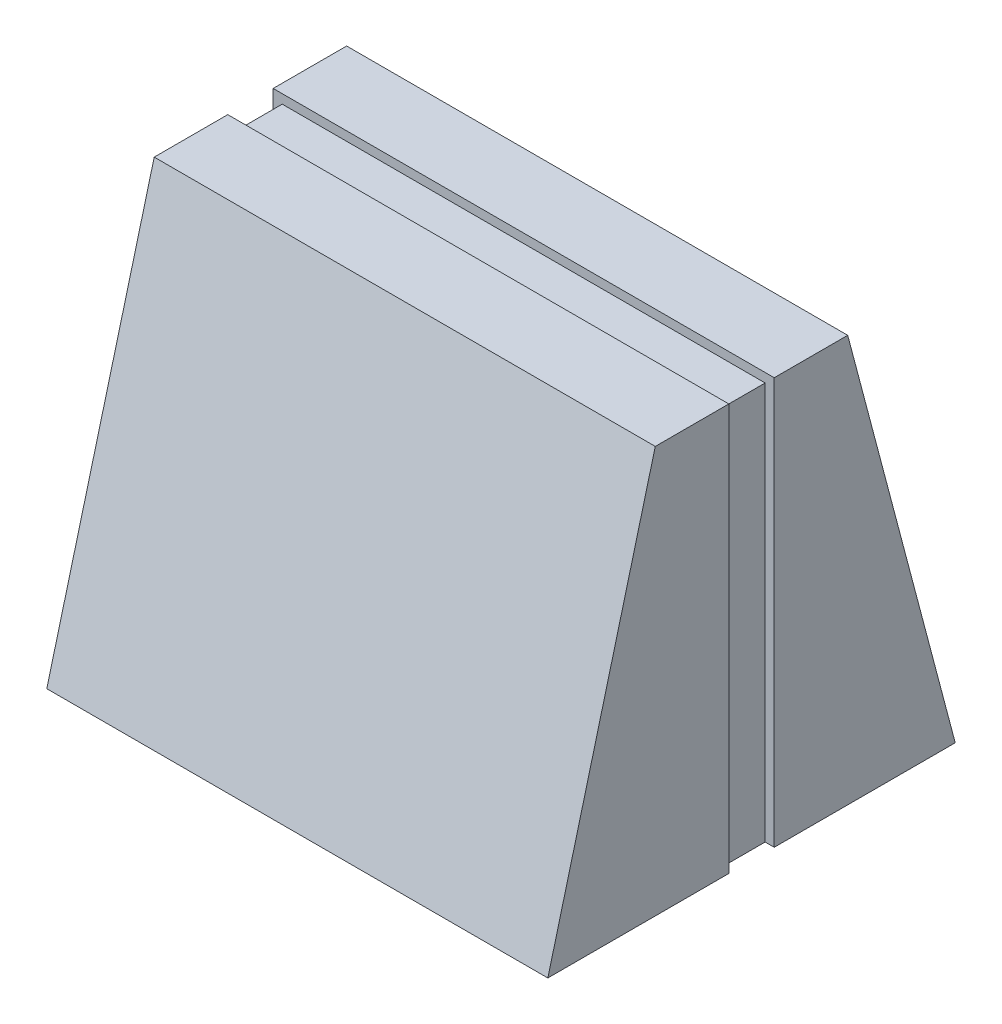
ISO-10303-21;
HEADER;
FILE_DESCRIPTION(('STEP AP214'),'2;1');
FILE_NAME('part.step','',(''),(''),'','','');
FILE_SCHEMA(('AUTOMOTIVE_DESIGN { 1 0 10303 214 1 1 1 1 }'));
ENDSEC;
DATA;
#1=APPLICATION_CONTEXT('core data for automotive mechanical design processes');
#2=APPLICATION_PROTOCOL_DEFINITION('international standard','automotive_design',2000,#1);
#3=PRODUCT_CONTEXT('',#1,'mechanical');
#4=PRODUCT('Part','Part','',(#3));
#5=PRODUCT_RELATED_PRODUCT_CATEGORY('part','',(#4));
#6=PRODUCT_DEFINITION_FORMATION('','',#4);
#7=PRODUCT_DEFINITION_CONTEXT('part definition',#1,'design');
#8=PRODUCT_DEFINITION('design','',#6,#7);
#9=PRODUCT_DEFINITION_SHAPE('','',#8);
#10=(LENGTH_UNIT() NAMED_UNIT(*) SI_UNIT(.MILLI.,.METRE.));
#11=(NAMED_UNIT(*) PLANE_ANGLE_UNIT() SI_UNIT($,.RADIAN.));
#12=(NAMED_UNIT(*) SI_UNIT($,.STERADIAN.) SOLID_ANGLE_UNIT());
#13=UNCERTAINTY_MEASURE_WITH_UNIT(LENGTH_MEASURE(1.E-05),#10,'distance_accuracy_value','');
#14=(GEOMETRIC_REPRESENTATION_CONTEXT(3) GLOBAL_UNCERTAINTY_ASSIGNED_CONTEXT((#13)) GLOBAL_UNIT_ASSIGNED_CONTEXT((#10,
#11,#12)) REPRESENTATION_CONTEXT('',''));
#15=CARTESIAN_POINT('',(0.,0.,0.));
#16=DIRECTION('',(0.,0.,1.));
#17=DIRECTION('',(1.,0.,0.));
#18=AXIS2_PLACEMENT_3D('',#15,#16,#17);
#19=CARTESIAN_POINT('',(0.,10.95,0.));
#20=DIRECTION('',(0.,-1.,0.));
#21=DIRECTION('',(0.,0.,-1.));
#22=AXIS2_PLACEMENT_3D('',#19,#20,#21);
#23=PLANE('',#22);
#24=DIRECTION('',(0.,0.,-1.));
#25=VECTOR('',#24,1.);
#26=CARTESIAN_POINT('',(-6.64999999999999,10.95,-0.625));
#27=LINE('',#26,#25);
#28=CARTESIAN_POINT('',(-6.64999999999999,10.95,0.625));
#29=VERTEX_POINT('',#28);
#30=CARTESIAN_POINT('',(-6.64999999999999,10.95,-0.625));
#31=VERTEX_POINT('',#30);
#32=EDGE_CURVE('E64',#29,#31,#27,.T.);
#33=ORIENTED_EDGE('',*,*,#32,.F.);
#34=DIRECTION('',(1.,0.,0.));
#35=VECTOR('',#34,1.);
#36=CARTESIAN_POINT('',(-6.90000000000002,10.95,0.625));
#37=LINE('',#36,#35);
#38=CARTESIAN_POINT('',(6.65000000000001,10.95,0.625));
#39=VERTEX_POINT('',#38);
#40=EDGE_CURVE('E175',#29,#39,#37,.T.);
#41=ORIENTED_EDGE('',*,*,#40,.T.);
#42=DIRECTION('',(0.,0.,1.));
#43=VECTOR('',#42,1.);
#44=CARTESIAN_POINT('',(6.65000000000001,10.95,0.625));
#45=LINE('',#44,#43);
#46=CARTESIAN_POINT('',(6.65000000000001,10.95,-0.625));
#47=VERTEX_POINT('',#46);
#48=EDGE_CURVE('E170',#47,#39,#45,.T.);
#49=ORIENTED_EDGE('',*,*,#48,.F.);
#50=DIRECTION('',(-1.,0.,0.));
#51=VECTOR('',#50,1.);
#52=CARTESIAN_POINT('',(-6.90000000000002,10.95,-0.625));
#53=LINE('',#52,#51);
#54=EDGE_CURVE('E173',#47,#31,#53,.T.);
#55=ORIENTED_EDGE('',*,*,#54,.T.);
#56=EDGE_LOOP('',(#33,#41,#49,#55));
#57=FACE_BOUND('',#56,.T.);
#58=ADVANCED_FACE('F45',(#57),#23,.F.);
#59=CARTESIAN_POINT('',(-6.89999999999999,0.,0.));
#60=DIRECTION('',(1.,0.,0.));
#61=DIRECTION('',(0.,1.,0.));
#62=AXIS2_PLACEMENT_3D('',#59,#60,#61);
#63=PLANE('',#62);
#64=DIRECTION('',(0.,0.,1.));
#65=VECTOR('',#64,1.);
#66=CARTESIAN_POINT('',(-6.89999999999999,0.,5.61000000000003));
#67=LINE('',#66,#65);
#68=CARTESIAN_POINT('',(-6.89999999999999,0.,-5.60999999999998));
#69=VERTEX_POINT('',#68);
#70=CARTESIAN_POINT('',(-6.89999999999999,0.,-0.625));
#71=VERTEX_POINT('',#70);
#72=EDGE_CURVE('E56',#69,#71,#67,.T.);
#73=ORIENTED_EDGE('',*,*,#72,.T.);
#74=DIRECTION('',(0.,1.,0.));
#75=VECTOR('',#74,1.);
#76=CARTESIAN_POINT('',(-6.90000000000002,10.95,-0.625));
#77=LINE('',#76,#75);
#78=CARTESIAN_POINT('',(-6.90000000000002,11.2,-0.625));
#79=VERTEX_POINT('',#78);
#80=EDGE_CURVE('E145',#71,#79,#77,.T.);
#81=ORIENTED_EDGE('',*,*,#80,.T.);
#82=DIRECTION('',(0.,0.,1.));
#83=VECTOR('',#82,1.);
#84=CARTESIAN_POINT('',(-6.89999999999999,11.2,2.65103330829409));
#85=LINE('',#84,#83);
#86=CARTESIAN_POINT('',(-6.89999999999999,11.2,-2.64896669170591));
#87=VERTEX_POINT('',#86);
#88=EDGE_CURVE('E291',#87,#79,#85,.T.);
#89=ORIENTED_EDGE('',*,*,#88,.F.);
#90=DIRECTION('',(0.,0.966783603676379,0.255596290392708));
#91=VECTOR('',#90,1.);
#92=CARTESIAN_POINT('',(-6.89999999999999,0.,-5.60999999999998));
#93=LINE('',#92,#91);
#94=EDGE_CURVE('E290',#69,#87,#93,.T.);
#95=ORIENTED_EDGE('',*,*,#94,.F.);
#96=EDGE_LOOP('',(#73,#81,#89,#95));
#97=FACE_BOUND('',#96,.T.);
#98=ADVANCED_FACE('F406',(#97),#63,.F.);
#99=CARTESIAN_POINT('',(6.90000000000001,0.,0.));
#100=DIRECTION('',(-1.,0.,0.));
#101=DIRECTION('',(0.,0.,1.));
#102=AXIS2_PLACEMENT_3D('',#99,#100,#101);
#103=PLANE('',#102);
#104=DIRECTION('',(0.,0.,-1.));
#105=VECTOR('',#104,1.);
#106=CARTESIAN_POINT('',(6.90000000000001,0.,5.61000000000003));
#107=LINE('',#106,#105);
#108=CARTESIAN_POINT('',(6.90000000000001,0.,5.61000000000003));
#109=VERTEX_POINT('',#108);
#110=CARTESIAN_POINT('',(6.90000000000001,0.,0.625));
#111=VERTEX_POINT('',#110);
#112=EDGE_CURVE('E378',#109,#111,#107,.T.);
#113=ORIENTED_EDGE('',*,*,#112,.T.);
#114=DIRECTION('',(0.,1.,0.));
#115=VECTOR('',#114,1.);
#116=CARTESIAN_POINT('',(6.90000000000001,10.95,0.625));
#117=LINE('',#116,#115);
#118=CARTESIAN_POINT('',(6.90000000000001,11.2,0.625));
#119=VERTEX_POINT('',#118);
#120=EDGE_CURVE('E415',#111,#119,#117,.T.);
#121=ORIENTED_EDGE('',*,*,#120,.T.);
#122=DIRECTION('',(0.,0.,-1.));
#123=VECTOR('',#122,1.);
#124=CARTESIAN_POINT('',(6.90000000000001,11.2,2.65103330829409));
#125=LINE('',#124,#123);
#126=CARTESIAN_POINT('',(6.90000000000001,11.2,2.65103330829409));
#127=VERTEX_POINT('',#126);
#128=EDGE_CURVE('E224',#127,#119,#125,.T.);
#129=ORIENTED_EDGE('',*,*,#128,.F.);
#130=DIRECTION('',(0.,0.966827672666624,-0.255429542860725));
#131=VECTOR('',#130,1.);
#132=CARTESIAN_POINT('',(6.90000000000001,0.,5.61000000000003));
#133=LINE('',#132,#131);
#134=EDGE_CURVE('E381',#109,#127,#133,.T.);
#135=ORIENTED_EDGE('',*,*,#134,.F.);
#136=EDGE_LOOP('',(#113,#121,#129,#135));
#137=FACE_BOUND('',#136,.T.);
#138=ADVANCED_FACE('F241',(#137),#103,.F.);
#139=CARTESIAN_POINT('',(0.,11.2,0.));
#140=DIRECTION('',(0.,-1.,0.));
#141=DIRECTION('',(0.,0.,-1.));
#142=AXIS2_PLACEMENT_3D('',#139,#140,#141);
#143=PLANE('',#142);
#144=ORIENTED_EDGE('',*,*,#128,.T.);
#145=DIRECTION('',(1.,0.,0.));
#146=VECTOR('',#145,1.);
#147=CARTESIAN_POINT('',(-6.90000000000002,11.2,0.625));
#148=LINE('',#147,#146);
#149=CARTESIAN_POINT('',(-6.90000000000002,11.2,0.625));
#150=VERTEX_POINT('',#149);
#151=EDGE_CURVE('E176',#150,#119,#148,.T.);
#152=ORIENTED_EDGE('',*,*,#151,.F.);
#153=CARTESIAN_POINT('',(-6.89999999999999,11.2,2.65103330829409));
#154=VERTEX_POINT('',#153);
#155=EDGE_CURVE('E316',#150,#154,#85,.T.);
#156=ORIENTED_EDGE('',*,*,#155,.T.);
#157=DIRECTION('',(1.,0.,0.));
#158=VECTOR('',#157,1.);
#159=CARTESIAN_POINT('',(-6.89999999999999,11.2,2.65103330829409));
#160=LINE('',#159,#158);
#161=EDGE_CURVE('E288',#154,#127,#160,.T.);
#162=ORIENTED_EDGE('',*,*,#161,.T.);
#163=EDGE_LOOP('',(#144,#152,#156,#162));
#164=FACE_BOUND('',#163,.T.);
#165=ADVANCED_FACE('F427',(#164),#143,.F.);
#166=ORIENTED_EDGE('',*,*,#88,.T.);
#167=DIRECTION('',(-1.,0.,0.));
#168=VECTOR('',#167,1.);
#169=CARTESIAN_POINT('',(-6.90000000000002,11.2,-0.625));
#170=LINE('',#169,#168);
#171=CARTESIAN_POINT('',(6.90000000000001,11.2,-0.625));
#172=VERTEX_POINT('',#171);
#173=EDGE_CURVE('E373',#172,#79,#170,.T.);
#174=ORIENTED_EDGE('',*,*,#173,.F.);
#175=CARTESIAN_POINT('',(6.90000000000001,11.2,-2.64896669170591));
#176=VERTEX_POINT('',#175);
#177=EDGE_CURVE('E421',#172,#176,#125,.T.);
#178=ORIENTED_EDGE('',*,*,#177,.T.);
#179=DIRECTION('',(-1.,0.,0.));
#180=VECTOR('',#179,1.);
#181=CARTESIAN_POINT('',(-6.89999999999999,11.2,-2.64896669170591));
#182=LINE('',#181,#180);
#183=EDGE_CURVE('E408',#176,#87,#182,.T.);
#184=ORIENTED_EDGE('',*,*,#183,.T.);
#185=EDGE_LOOP('',(#166,#174,#178,#184));
#186=FACE_BOUND('',#185,.T.);
#187=ADVANCED_FACE('F47',(#186),#143,.F.);
#188=CARTESIAN_POINT('',(0.,0.,0.));
#189=DIRECTION('',(0.,-1.,0.));
#190=DIRECTION('',(0.,0.,-1.));
#191=AXIS2_PLACEMENT_3D('',#188,#189,#190);
#192=PLANE('',#191);
#193=DIRECTION('',(-1.,0.,0.));
#194=VECTOR('',#193,1.);
#195=CARTESIAN_POINT('',(-6.64999999999999,0.,-0.625));
#196=LINE('',#195,#194);
#197=CARTESIAN_POINT('',(-6.64999999999999,0.,-0.625));
#198=VERTEX_POINT('',#197);
#199=EDGE_CURVE('E139',#198,#71,#196,.T.);
#200=ORIENTED_EDGE('',*,*,#199,.T.);
#201=ORIENTED_EDGE('',*,*,#72,.F.);
#202=DIRECTION('',(-1.,0.,0.));
#203=VECTOR('',#202,1.);
#204=CARTESIAN_POINT('',(-6.89999999999999,0.,-5.60999999999998));
#205=LINE('',#204,#203);
#206=CARTESIAN_POINT('',(6.90000000000001,0.,-5.60999999999998));
#207=VERTEX_POINT('',#206);
#208=EDGE_CURVE('E380',#207,#69,#205,.T.);
#209=ORIENTED_EDGE('',*,*,#208,.F.);
#210=CARTESIAN_POINT('',(6.90000000000001,0.,-0.625000000000001));
#211=VERTEX_POINT('',#210);
#212=EDGE_CURVE('E264',#211,#207,#107,.T.);
#213=ORIENTED_EDGE('',*,*,#212,.F.);
#214=DIRECTION('',(1.,0.,0.));
#215=VECTOR('',#214,1.);
#216=CARTESIAN_POINT('',(6.65000000000001,0.,-0.625000000000001));
#217=LINE('',#216,#215);
#218=CARTESIAN_POINT('',(6.65000000000001,0.,-0.625000000000001));
#219=VERTEX_POINT('',#218);
#220=EDGE_CURVE('E369',#219,#211,#217,.T.);
#221=ORIENTED_EDGE('',*,*,#220,.F.);
#222=DIRECTION('',(0.,0.,-1.));
#223=VECTOR('',#222,1.);
#224=CARTESIAN_POINT('',(6.65000000000001,0.,0.625));
#225=LINE('',#224,#223);
#226=CARTESIAN_POINT('',(6.65000000000001,0.,0.625));
#227=VERTEX_POINT('',#226);
#228=EDGE_CURVE('E167',#227,#219,#225,.T.);
#229=ORIENTED_EDGE('',*,*,#228,.F.);
#230=DIRECTION('',(1.,0.,0.));
#231=VECTOR('',#230,1.);
#232=CARTESIAN_POINT('',(6.65000000000001,0.,0.625));
#233=LINE('',#232,#231);
#234=EDGE_CURVE('E172',#227,#111,#233,.T.);
#235=ORIENTED_EDGE('',*,*,#234,.T.);
#236=ORIENTED_EDGE('',*,*,#112,.F.);
#237=DIRECTION('',(1.,0.,0.));
#238=VECTOR('',#237,1.);
#239=CARTESIAN_POINT('',(-6.89999999999999,0.,5.61000000000003));
#240=LINE('',#239,#238);
#241=CARTESIAN_POINT('',(-6.89999999999999,0.,5.61000000000003));
#242=VERTEX_POINT('',#241);
#243=EDGE_CURVE('E12',#242,#109,#240,.T.);
#244=ORIENTED_EDGE('',*,*,#243,.F.);
#245=CARTESIAN_POINT('',(-6.89999999999999,0.,0.625));
#246=VERTEX_POINT('',#245);
#247=EDGE_CURVE('E50',#246,#242,#67,.T.);
#248=ORIENTED_EDGE('',*,*,#247,.F.);
#249=DIRECTION('',(-1.,0.,0.));
#250=VECTOR('',#249,1.);
#251=CARTESIAN_POINT('',(-6.64999999999999,0.,0.625));
#252=LINE('',#251,#250);
#253=CARTESIAN_POINT('',(-6.64999999999999,0.,0.625));
#254=VERTEX_POINT('',#253);
#255=EDGE_CURVE('E149',#254,#246,#252,.T.);
#256=ORIENTED_EDGE('',*,*,#255,.F.);
#257=DIRECTION('',(0.,0.,1.));
#258=VECTOR('',#257,1.);
#259=CARTESIAN_POINT('',(-6.64999999999999,0.,-0.625));
#260=LINE('',#259,#258);
#261=EDGE_CURVE('E153',#198,#254,#260,.T.);
#262=ORIENTED_EDGE('',*,*,#261,.F.);
#263=EDGE_LOOP('',(#200,#201,#209,#213,#221,#229,#235,#236,#244,#248,#256,#262));
#264=FACE_BOUND('',#263,.T.);
#265=ADVANCED_FACE('F156',(#264),#192,.T.);
#266=CARTESIAN_POINT('',(0.,1.38542512604882,5.24397974983656));
#267=DIRECTION('',(0.,-0.255429542860725,-0.966827672666625));
#268=DIRECTION('',(0.,0.966827672666624,-0.255429542860725));
#269=AXIS2_PLACEMENT_3D('',#266,#267,#268);
#270=PLANE('',#269);
#271=ORIENTED_EDGE('',*,*,#134,.T.);
#272=ORIENTED_EDGE('',*,*,#161,.F.);
#273=DIRECTION('',(0.,0.966827672666624,-0.255429542860725));
#274=VECTOR('',#273,1.);
#275=CARTESIAN_POINT('',(-6.89999999999999,0.,5.61000000000003));
#276=LINE('',#275,#274);
#277=EDGE_CURVE('E189',#242,#154,#276,.T.);
#278=ORIENTED_EDGE('',*,*,#277,.F.);
#279=ORIENTED_EDGE('',*,*,#243,.T.);
#280=EDGE_LOOP('',(#271,#272,#278,#279));
#281=FACE_BOUND('',#280,.T.);
#282=ADVANCED_FACE('F191',(#281),#270,.F.);
#283=DIRECTION('',(0.,1.,0.));
#284=VECTOR('',#283,1.);
#285=CARTESIAN_POINT('',(-6.90000000000002,10.95,0.625));
#286=LINE('',#285,#284);
#287=EDGE_CURVE('E364',#246,#150,#286,.T.);
#288=ORIENTED_EDGE('',*,*,#287,.F.);
#289=ORIENTED_EDGE('',*,*,#247,.T.);
#290=ORIENTED_EDGE('',*,*,#277,.T.);
#291=ORIENTED_EDGE('',*,*,#155,.F.);
#292=EDGE_LOOP('',(#288,#289,#290,#291));
#293=FACE_BOUND('',#292,.T.);
#294=ADVANCED_FACE('F201',(#293),#63,.F.);
#295=DIRECTION('',(0.,1.,0.));
#296=VECTOR('',#295,1.);
#297=CARTESIAN_POINT('',(6.90000000000001,10.95,-0.625));
#298=LINE('',#297,#296);
#299=EDGE_CURVE('E178',#211,#172,#298,.T.);
#300=ORIENTED_EDGE('',*,*,#299,.F.);
#301=ORIENTED_EDGE('',*,*,#212,.T.);
#302=DIRECTION('',(0.,0.966783603676379,0.255596290392708));
#303=VECTOR('',#302,1.);
#304=CARTESIAN_POINT('',(6.90000000000001,0.,-5.60999999999998));
#305=LINE('',#304,#303);
#306=EDGE_CURVE('E251',#207,#176,#305,.T.);
#307=ORIENTED_EDGE('',*,*,#306,.T.);
#308=ORIENTED_EDGE('',*,*,#177,.F.);
#309=EDGE_LOOP('',(#300,#301,#307,#308));
#310=FACE_BOUND('',#309,.T.);
#311=ADVANCED_FACE('F231',(#310),#103,.F.);
#312=CARTESIAN_POINT('',(0.,1.3862663582153,-5.24350170885328));
#313=DIRECTION('',(0.,-0.255596290392708,0.966783603676379));
#314=DIRECTION('',(0.,-0.966783603676379,-0.255596290392708));
#315=AXIS2_PLACEMENT_3D('',#312,#313,#314);
#316=PLANE('',#315);
#317=ORIENTED_EDGE('',*,*,#94,.T.);
#318=ORIENTED_EDGE('',*,*,#183,.F.);
#319=ORIENTED_EDGE('',*,*,#306,.F.);
#320=ORIENTED_EDGE('',*,*,#208,.T.);
#321=EDGE_LOOP('',(#317,#318,#319,#320));
#322=FACE_BOUND('',#321,.T.);
#323=ADVANCED_FACE('F239',(#322),#316,.F.);
#324=CARTESIAN_POINT('',(-6.90000000000002,10.95,0.625));
#325=DIRECTION('',(0.,0.,1.));
#326=DIRECTION('',(1.,0.,0.));
#327=AXIS2_PLACEMENT_3D('',#324,#325,#326);
#328=PLANE('',#327);
#329=ORIENTED_EDGE('',*,*,#151,.T.);
#330=ORIENTED_EDGE('',*,*,#120,.F.);
#331=ORIENTED_EDGE('',*,*,#234,.F.);
#332=DIRECTION('',(0.,-1.,0.));
#333=VECTOR('',#332,1.);
#334=CARTESIAN_POINT('',(6.65000000000001,10.95,0.625));
#335=LINE('',#334,#333);
#336=EDGE_CURVE('E164',#39,#227,#335,.T.);
#337=ORIENTED_EDGE('',*,*,#336,.F.);
#338=ORIENTED_EDGE('',*,*,#40,.F.);
#339=DIRECTION('',(0.,1.,0.));
#340=VECTOR('',#339,1.);
#341=CARTESIAN_POINT('',(-6.64999999999999,10.95,0.625));
#342=LINE('',#341,#340);
#343=EDGE_CURVE('E159',#254,#29,#342,.T.);
#344=ORIENTED_EDGE('',*,*,#343,.F.);
#345=ORIENTED_EDGE('',*,*,#255,.T.);
#346=ORIENTED_EDGE('',*,*,#287,.T.);
#347=EDGE_LOOP('',(#329,#330,#331,#337,#338,#344,#345,#346));
#348=FACE_BOUND('',#347,.T.);
#349=ADVANCED_FACE('F363',(#348),#328,.F.);
#350=CARTESIAN_POINT('',(-6.90000000000002,10.95,-0.625));
#351=DIRECTION('',(0.,0.,-1.));
#352=DIRECTION('',(-1.,0.,0.));
#353=AXIS2_PLACEMENT_3D('',#350,#351,#352);
#354=PLANE('',#353);
#355=ORIENTED_EDGE('',*,*,#173,.T.);
#356=ORIENTED_EDGE('',*,*,#80,.F.);
#357=ORIENTED_EDGE('',*,*,#199,.F.);
#358=DIRECTION('',(0.,-1.,0.));
#359=VECTOR('',#358,1.);
#360=CARTESIAN_POINT('',(-6.64999999999999,10.95,-0.625));
#361=LINE('',#360,#359);
#362=EDGE_CURVE('E142',#31,#198,#361,.T.);
#363=ORIENTED_EDGE('',*,*,#362,.F.);
#364=ORIENTED_EDGE('',*,*,#54,.F.);
#365=DIRECTION('',(0.,1.,0.));
#366=VECTOR('',#365,1.);
#367=CARTESIAN_POINT('',(6.65000000000001,10.95,-0.625));
#368=LINE('',#367,#366);
#369=EDGE_CURVE('E72',#219,#47,#368,.T.);
#370=ORIENTED_EDGE('',*,*,#369,.F.);
#371=ORIENTED_EDGE('',*,*,#220,.T.);
#372=ORIENTED_EDGE('',*,*,#299,.T.);
#373=EDGE_LOOP('',(#355,#356,#357,#363,#364,#370,#371,#372));
#374=FACE_BOUND('',#373,.T.);
#375=ADVANCED_FACE('F140',(#374),#354,.F.);
#376=CARTESIAN_POINT('',(6.65000000000001,0.,0.));
#377=DIRECTION('',(1.,0.,0.));
#378=DIRECTION('',(0.,0.,-1.));
#379=AXIS2_PLACEMENT_3D('',#376,#377,#378);
#380=PLANE('',#379);
#381=ORIENTED_EDGE('',*,*,#336,.T.);
#382=ORIENTED_EDGE('',*,*,#228,.T.);
#383=ORIENTED_EDGE('',*,*,#369,.T.);
#384=ORIENTED_EDGE('',*,*,#48,.T.);
#385=EDGE_LOOP('',(#381,#382,#383,#384));
#386=FACE_BOUND('',#385,.T.);
#387=ADVANCED_FACE('F371',(#386),#380,.T.);
#388=CARTESIAN_POINT('',(-6.64999999999999,0.,0.));
#389=DIRECTION('',(-1.,0.,0.));
#390=DIRECTION('',(0.,-1.,0.));
#391=AXIS2_PLACEMENT_3D('',#388,#389,#390);
#392=PLANE('',#391);
#393=ORIENTED_EDGE('',*,*,#362,.T.);
#394=ORIENTED_EDGE('',*,*,#261,.T.);
#395=ORIENTED_EDGE('',*,*,#343,.T.);
#396=ORIENTED_EDGE('',*,*,#32,.T.);
#397=EDGE_LOOP('',(#393,#394,#395,#396));
#398=FACE_BOUND('',#397,.T.);
#399=ADVANCED_FACE('F152',(#398),#392,.T.);
#400=CLOSED_SHELL('',(#58,#98,#138,#165,#187,#265,#282,#294,#311,#323,#349,#375,#387,#399));
#401=MANIFOLD_SOLID_BREP('B2',#400);
#402=ADVANCED_BREP_SHAPE_REPRESENTATION('',(#18,#401),#14);
#403=SHAPE_DEFINITION_REPRESENTATION(#9,#402);
ENDSEC;
END-ISO-10303-21;
